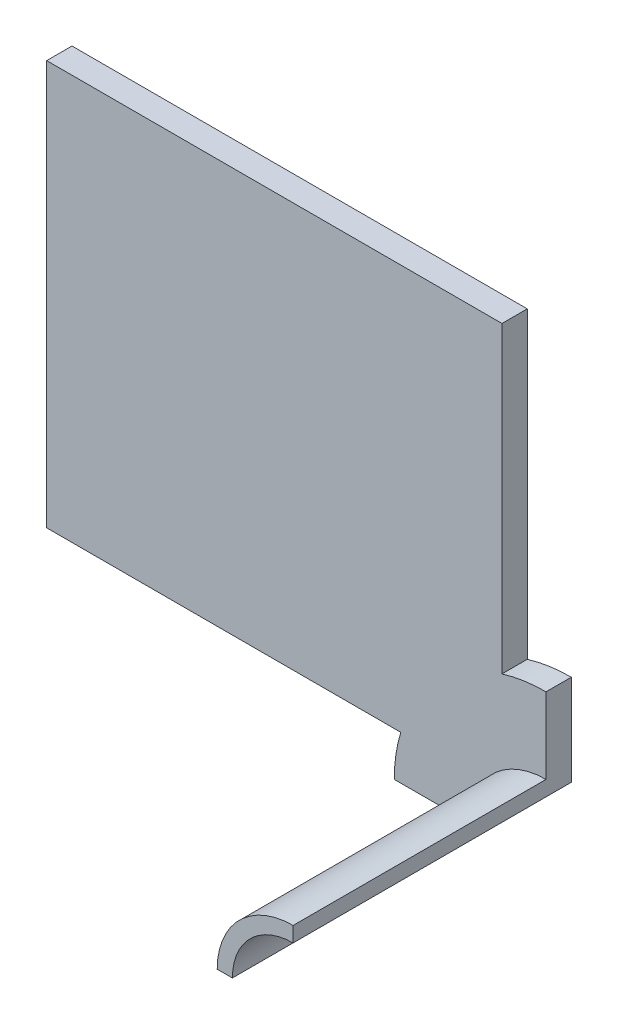
ISO-10303-21;
HEADER;
FILE_DESCRIPTION(('STEP AP214'),'2;1');
FILE_NAME('part.step','',(''),(''),'','','');
FILE_SCHEMA(('AUTOMOTIVE_DESIGN { 1 0 10303 214 1 1 1 1 }'));
ENDSEC;
DATA;
#1=APPLICATION_CONTEXT('core data for automotive mechanical design processes');
#2=APPLICATION_PROTOCOL_DEFINITION('international standard','automotive_design',2000,#1);
#3=PRODUCT_CONTEXT('',#1,'mechanical');
#4=PRODUCT('Part','Part','',(#3));
#5=PRODUCT_RELATED_PRODUCT_CATEGORY('part','',(#4));
#6=PRODUCT_DEFINITION_FORMATION('','',#4);
#7=PRODUCT_DEFINITION_CONTEXT('part definition',#1,'design');
#8=PRODUCT_DEFINITION('design','',#6,#7);
#9=PRODUCT_DEFINITION_SHAPE('','',#8);
#10=(LENGTH_UNIT() NAMED_UNIT(*) SI_UNIT(.MILLI.,.METRE.));
#11=(NAMED_UNIT(*) PLANE_ANGLE_UNIT() SI_UNIT($,.RADIAN.));
#12=(NAMED_UNIT(*) SI_UNIT($,.STERADIAN.) SOLID_ANGLE_UNIT());
#13=UNCERTAINTY_MEASURE_WITH_UNIT(LENGTH_MEASURE(1.E-05),#10,'distance_accuracy_value','');
#14=(GEOMETRIC_REPRESENTATION_CONTEXT(3) GLOBAL_UNCERTAINTY_ASSIGNED_CONTEXT((#13)) GLOBAL_UNIT_ASSIGNED_CONTEXT((#10,
#11,#12)) REPRESENTATION_CONTEXT('',''));
#15=CARTESIAN_POINT('',(0.,0.,0.));
#16=DIRECTION('',(0.,0.,1.));
#17=DIRECTION('',(1.,0.,0.));
#18=AXIS2_PLACEMENT_3D('',#15,#16,#17);
#19=CARTESIAN_POINT('',(0.489385379979,-0.435047626992,0.55));
#20=DIRECTION('',(0.,0.,1.));
#21=DIRECTION('',(1.,0.,0.));
#22=AXIS2_PLACEMENT_3D('',#19,#20,#21);
#23=PLANE('',#22);
#24=DIRECTION('',(0.,-1.,0.));
#25=VECTOR('',#24,1.);
#26=CARTESIAN_POINT('',(0.987082869339,-0.587082869339,0.55));
#27=LINE('',#26,#25);
#28=CARTESIAN_POINT('',(0.987082869339,-0.737082869339,0.55));
#29=VERTEX_POINT('',#28);
#30=CARTESIAN_POINT('',(0.987082869339,-0.767082869339,0.55));
#31=VERTEX_POINT('',#30);
#32=EDGE_CURVE('E132',#29,#31,#27,.T.);
#33=ORIENTED_EDGE('',*,*,#32,.F.);
#34=CARTESIAN_POINT('',(0.987082869339,-0.887082869339,0.55));
#35=DIRECTION('',(0.,0.,1.));
#36=DIRECTION('',(1.,0.,0.));
#37=AXIS2_PLACEMENT_3D('',#34,#35,#36);
#38=CIRCLE('',#37,0.15);
#39=CARTESIAN_POINT('',(0.837082869339,-0.887082869339,0.55));
#40=VERTEX_POINT('',#39);
#41=EDGE_CURVE('E11',#29,#40,#38,.T.);
#42=ORIENTED_EDGE('',*,*,#41,.T.);
#43=DIRECTION('',(1.,0.,0.));
#44=VECTOR('',#43,1.);
#45=CARTESIAN_POINT('',(0.687082869339,-0.887082869339,0.55));
#46=LINE('',#45,#44);
#47=CARTESIAN_POINT('',(0.867082869339,-0.887082869339,0.55));
#48=VERTEX_POINT('',#47);
#49=EDGE_CURVE('E167',#40,#48,#46,.T.);
#50=ORIENTED_EDGE('',*,*,#49,.T.);
#51=CARTESIAN_POINT('',(0.987082869339,-0.887082869339,0.55));
#52=DIRECTION('',(0.,0.,1.));
#53=DIRECTION('',(1.,0.,0.));
#54=AXIS2_PLACEMENT_3D('',#51,#52,#53);
#55=CIRCLE('',#54,0.12);
#56=EDGE_CURVE('E26',#31,#48,#55,.T.);
#57=ORIENTED_EDGE('',*,*,#56,.F.);
#58=EDGE_LOOP('',(#33,#42,#50,#57));
#59=FACE_BOUND('',#58,.T.);
#60=ADVANCED_FACE('F17',(#59),#23,.T.);
#61=CARTESIAN_POINT('',(0.987082869339,-0.887082869339,0.55));
#62=DIRECTION('',(0.,0.,1.));
#63=DIRECTION('',(1.,0.,0.));
#64=AXIS2_PLACEMENT_3D('',#61,#62,#63);
#65=CYLINDRICAL_SURFACE('',#64,0.15);
#66=DIRECTION('',(0.,0.,-1.));
#67=VECTOR('',#66,1.);
#68=CARTESIAN_POINT('',(0.987082869339,-0.737082869339,0.55));
#69=LINE('',#68,#67);
#70=CARTESIAN_POINT('',(0.987082869339,-0.737082869339,0.05));
#71=VERTEX_POINT('',#70);
#72=EDGE_CURVE('E127',#29,#71,#69,.T.);
#73=ORIENTED_EDGE('',*,*,#72,.T.);
#74=CARTESIAN_POINT('',(0.987082869339,-0.887082869339,0.05));
#75=DIRECTION('',(0.,0.,1.));
#76=DIRECTION('',(1.,0.,0.));
#77=AXIS2_PLACEMENT_3D('',#74,#75,#76);
#78=CIRCLE('',#77,0.15);
#79=CARTESIAN_POINT('',(0.837082869339,-0.887082869339,0.05));
#80=VERTEX_POINT('',#79);
#81=EDGE_CURVE('E145',#71,#80,#78,.T.);
#82=ORIENTED_EDGE('',*,*,#81,.T.);
#83=DIRECTION('',(0.,0.,-1.));
#84=VECTOR('',#83,1.);
#85=CARTESIAN_POINT('',(0.837082869339,-0.887082869339,0.55));
#86=LINE('',#85,#84);
#87=EDGE_CURVE('E129',#40,#80,#86,.T.);
#88=ORIENTED_EDGE('',*,*,#87,.F.);
#89=ORIENTED_EDGE('',*,*,#41,.F.);
#90=EDGE_LOOP('',(#73,#82,#88,#89));
#91=FACE_BOUND('',#90,.T.);
#92=ADVANCED_FACE('F124',(#91),#65,.T.);
#93=CARTESIAN_POINT('',(0.987082869339,-0.887082869339,0.));
#94=DIRECTION('',(0.,0.,-1.));
#95=DIRECTION('',(1.,0.,0.));
#96=AXIS2_PLACEMENT_3D('',#93,#94,#95);
#97=CYLINDRICAL_SURFACE('',#96,0.12);
#98=DIRECTION('',(0.,0.,1.));
#99=VECTOR('',#98,1.);
#100=CARTESIAN_POINT('',(0.987082869339,-0.767082869339,0.));
#101=LINE('',#100,#99);
#102=CARTESIAN_POINT('',(0.987082869339,-0.767082869339,0.));
#103=VERTEX_POINT('',#102);
#104=EDGE_CURVE('E135',#103,#31,#101,.T.);
#105=ORIENTED_EDGE('',*,*,#104,.T.);
#106=ORIENTED_EDGE('',*,*,#56,.T.);
#107=DIRECTION('',(0.,0.,1.));
#108=VECTOR('',#107,1.);
#109=CARTESIAN_POINT('',(0.867082869339,-0.887082869339,0.));
#110=LINE('',#109,#108);
#111=CARTESIAN_POINT('',(0.867082869339,-0.887082869339,0.));
#112=VERTEX_POINT('',#111);
#113=EDGE_CURVE('E163',#112,#48,#110,.T.);
#114=ORIENTED_EDGE('',*,*,#113,.F.);
#115=CARTESIAN_POINT('',(0.987082869339,-0.887082869339,0.));
#116=DIRECTION('',(0.,0.,1.));
#117=DIRECTION('',(1.,0.,0.));
#118=AXIS2_PLACEMENT_3D('',#115,#116,#117);
#119=CIRCLE('',#118,0.12);
#120=EDGE_CURVE('E304',#103,#112,#119,.T.);
#121=ORIENTED_EDGE('',*,*,#120,.F.);
#122=EDGE_LOOP('',(#105,#106,#114,#121));
#123=FACE_BOUND('',#122,.T.);
#124=ADVANCED_FACE('F19',(#123),#97,.F.);
#125=CARTESIAN_POINT('',(0.687082869339,-0.887082869339,0.));
#126=DIRECTION('',(0.,1.,0.));
#127=DIRECTION('',(1.,0.,0.));
#128=AXIS2_PLACEMENT_3D('',#125,#126,#127);
#129=PLANE('',#128);
#130=DIRECTION('',(1.,0.,0.));
#131=VECTOR('',#130,1.);
#132=CARTESIAN_POINT('',(0.687082869339,-0.887082869339,0.));
#133=LINE('',#132,#131);
#134=CARTESIAN_POINT('',(0.687082869339,-0.887082869339,0.));
#135=VERTEX_POINT('',#134);
#136=EDGE_CURVE('E340',#135,#112,#133,.T.);
#137=ORIENTED_EDGE('',*,*,#136,.T.);
#138=ORIENTED_EDGE('',*,*,#113,.T.);
#139=ORIENTED_EDGE('',*,*,#49,.F.);
#140=ORIENTED_EDGE('',*,*,#87,.T.);
#141=DIRECTION('',(-1.,0.,0.));
#142=VECTOR('',#141,1.);
#143=CARTESIAN_POINT('',(0.837082869339,-0.887082869339,0.05));
#144=LINE('',#143,#142);
#145=CARTESIAN_POINT('',(0.687082869339,-0.887082869339,0.05));
#146=VERTEX_POINT('',#145);
#147=EDGE_CURVE('E379',#80,#146,#144,.T.);
#148=ORIENTED_EDGE('',*,*,#147,.T.);
#149=DIRECTION('',(0.,0.,1.));
#150=VECTOR('',#149,1.);
#151=CARTESIAN_POINT('',(0.687082869339,-0.887082869339,0.));
#152=LINE('',#151,#150);
#153=EDGE_CURVE('E160',#135,#146,#152,.T.);
#154=ORIENTED_EDGE('',*,*,#153,.F.);
#155=EDGE_LOOP('',(#137,#138,#139,#140,#148,#154));
#156=FACE_BOUND('',#155,.T.);
#157=ADVANCED_FACE('F262',(#156),#129,.F.);
#158=CARTESIAN_POINT('',(0.987082869339,-0.887082869339,0.));
#159=DIRECTION('',(0.,0.,-1.));
#160=DIRECTION('',(1.,0.,0.));
#161=AXIS2_PLACEMENT_3D('',#158,#159,#160);
#162=CYLINDRICAL_SURFACE('',#161,0.3);
#163=CARTESIAN_POINT('',(0.987082869339,-0.887082869339,0.));
#164=DIRECTION('',(0.,0.,1.));
#165=DIRECTION('',(1.,0.,0.));
#166=AXIS2_PLACEMENT_3D('',#163,#164,#165);
#167=CIRCLE('',#166,0.3);
#168=CARTESIAN_POINT('',(0.7,-0.8,0.));
#169=VERTEX_POINT('',#168);
#170=EDGE_CURVE('E335',#169,#135,#167,.T.);
#171=ORIENTED_EDGE('',*,*,#170,.T.);
#172=ORIENTED_EDGE('',*,*,#153,.T.);
#173=CARTESIAN_POINT('',(0.987082869339,-0.887082869339,0.05));
#174=DIRECTION('',(0.,0.,1.));
#175=DIRECTION('',(1.,0.,0.));
#176=AXIS2_PLACEMENT_3D('',#173,#174,#175);
#177=CIRCLE('',#176,0.3);
#178=CARTESIAN_POINT('',(0.7,-0.8,0.05));
#179=VERTEX_POINT('',#178);
#180=EDGE_CURVE('E375',#179,#146,#177,.T.);
#181=ORIENTED_EDGE('',*,*,#180,.F.);
#182=DIRECTION('',(0.,0.,1.));
#183=VECTOR('',#182,1.);
#184=CARTESIAN_POINT('',(0.7,-0.8,0.));
#185=LINE('',#184,#183);
#186=EDGE_CURVE('E157',#169,#179,#185,.T.);
#187=ORIENTED_EDGE('',*,*,#186,.F.);
#188=EDGE_LOOP('',(#171,#172,#181,#187));
#189=FACE_BOUND('',#188,.T.);
#190=ADVANCED_FACE('F257',(#189),#162,.T.);
#191=CARTESIAN_POINT('',(0.,-0.8,0.));
#192=DIRECTION('',(0.,1.,0.));
#193=DIRECTION('',(1.,0.,0.));
#194=AXIS2_PLACEMENT_3D('',#191,#192,#193);
#195=PLANE('',#194);
#196=DIRECTION('',(1.,0.,0.));
#197=VECTOR('',#196,1.);
#198=CARTESIAN_POINT('',(0.,-0.8,0.));
#199=LINE('',#198,#197);
#200=CARTESIAN_POINT('',(0.,-0.8,0.));
#201=VERTEX_POINT('',#200);
#202=EDGE_CURVE('E339',#201,#169,#199,.T.);
#203=ORIENTED_EDGE('',*,*,#202,.T.);
#204=ORIENTED_EDGE('',*,*,#186,.T.);
#205=DIRECTION('',(1.,0.,0.));
#206=VECTOR('',#205,1.);
#207=CARTESIAN_POINT('',(0.,-0.8,0.05));
#208=LINE('',#207,#206);
#209=CARTESIAN_POINT('',(0.,-0.8,0.05));
#210=VERTEX_POINT('',#209);
#211=EDGE_CURVE('E371',#210,#179,#208,.T.);
#212=ORIENTED_EDGE('',*,*,#211,.F.);
#213=DIRECTION('',(0.,0.,1.));
#214=VECTOR('',#213,1.);
#215=CARTESIAN_POINT('',(0.,-0.8,0.));
#216=LINE('',#215,#214);
#217=EDGE_CURVE('E154',#201,#210,#216,.T.);
#218=ORIENTED_EDGE('',*,*,#217,.F.);
#219=EDGE_LOOP('',(#203,#204,#212,#218));
#220=FACE_BOUND('',#219,.T.);
#221=ADVANCED_FACE('F244',(#220),#195,.F.);
#222=CARTESIAN_POINT('',(0.,0.,0.));
#223=DIRECTION('',(1.,0.,0.));
#224=DIRECTION('',(0.,1.,0.));
#225=AXIS2_PLACEMENT_3D('',#222,#223,#224);
#226=PLANE('',#225);
#227=DIRECTION('',(0.,-1.,0.));
#228=VECTOR('',#227,1.);
#229=CARTESIAN_POINT('',(0.,0.,0.));
#230=LINE('',#229,#228);
#231=CARTESIAN_POINT('',(0.,0.,0.));
#232=VERTEX_POINT('',#231);
#233=EDGE_CURVE('E350',#232,#201,#230,.T.);
#234=ORIENTED_EDGE('',*,*,#233,.T.);
#235=ORIENTED_EDGE('',*,*,#217,.T.);
#236=DIRECTION('',(0.,-1.,0.));
#237=VECTOR('',#236,1.);
#238=CARTESIAN_POINT('',(0.,0.,0.05));
#239=LINE('',#238,#237);
#240=CARTESIAN_POINT('',(0.,0.,0.05));
#241=VERTEX_POINT('',#240);
#242=EDGE_CURVE('E367',#241,#210,#239,.T.);
#243=ORIENTED_EDGE('',*,*,#242,.F.);
#244=DIRECTION('',(0.,0.,1.));
#245=VECTOR('',#244,1.);
#246=CARTESIAN_POINT('',(0.,0.,0.));
#247=LINE('',#246,#245);
#248=EDGE_CURVE('E151',#232,#241,#247,.T.);
#249=ORIENTED_EDGE('',*,*,#248,.F.);
#250=EDGE_LOOP('',(#234,#235,#243,#249));
#251=FACE_BOUND('',#250,.T.);
#252=ADVANCED_FACE('F235',(#251),#226,.F.);
#253=CARTESIAN_POINT('',(0.9,0.,0.));
#254=DIRECTION('',(0.,-1.,0.));
#255=DIRECTION('',(0.,0.,-1.));
#256=AXIS2_PLACEMENT_3D('',#253,#254,#255);
#257=PLANE('',#256);
#258=DIRECTION('',(-1.,0.,0.));
#259=VECTOR('',#258,1.);
#260=CARTESIAN_POINT('',(0.9,0.,0.));
#261=LINE('',#260,#259);
#262=CARTESIAN_POINT('',(0.9,0.,0.));
#263=VERTEX_POINT('',#262);
#264=EDGE_CURVE('E333',#263,#232,#261,.T.);
#265=ORIENTED_EDGE('',*,*,#264,.T.);
#266=ORIENTED_EDGE('',*,*,#248,.T.);
#267=DIRECTION('',(1.,0.,0.));
#268=VECTOR('',#267,1.);
#269=CARTESIAN_POINT('',(0.,0.,0.05));
#270=LINE('',#269,#268);
#271=CARTESIAN_POINT('',(0.9,0.,0.05));
#272=VERTEX_POINT('',#271);
#273=EDGE_CURVE('E345',#241,#272,#270,.T.);
#274=ORIENTED_EDGE('',*,*,#273,.T.);
#275=DIRECTION('',(0.,0.,1.));
#276=VECTOR('',#275,1.);
#277=CARTESIAN_POINT('',(0.9,0.,0.));
#278=LINE('',#277,#276);
#279=EDGE_CURVE('E332',#263,#272,#278,.T.);
#280=ORIENTED_EDGE('',*,*,#279,.F.);
#281=EDGE_LOOP('',(#265,#266,#274,#280));
#282=FACE_BOUND('',#281,.T.);
#283=ADVANCED_FACE('F227',(#282),#257,.F.);
#284=CARTESIAN_POINT('',(0.987082869339,-0.587082869339,0.));
#285=DIRECTION('',(1.,0.,0.));
#286=DIRECTION('',(0.,1.,0.));
#287=AXIS2_PLACEMENT_3D('',#284,#285,#286);
#288=PLANE('',#287);
#289=DIRECTION('',(0.,-1.,0.));
#290=VECTOR('',#289,1.);
#291=CARTESIAN_POINT('',(0.987082869339,-0.587082869339,0.));
#292=LINE('',#291,#290);
#293=CARTESIAN_POINT('',(0.987082869339,-0.587082869339,0.));
#294=VERTEX_POINT('',#293);
#295=EDGE_CURVE('E306',#294,#103,#292,.T.);
#296=ORIENTED_EDGE('',*,*,#295,.F.);
#297=DIRECTION('',(0.,0.,1.));
#298=VECTOR('',#297,1.);
#299=CARTESIAN_POINT('',(0.987082869339,-0.587082869339,0.));
#300=LINE('',#299,#298);
#301=CARTESIAN_POINT('',(0.987082869339,-0.587082869339,0.05));
#302=VERTEX_POINT('',#301);
#303=EDGE_CURVE('E308',#294,#302,#300,.T.);
#304=ORIENTED_EDGE('',*,*,#303,.T.);
#305=DIRECTION('',(0.,1.,0.));
#306=VECTOR('',#305,1.);
#307=CARTESIAN_POINT('',(0.987082869339,-0.737082869339,0.05));
#308=LINE('',#307,#306);
#309=EDGE_CURVE('E139',#71,#302,#308,.T.);
#310=ORIENTED_EDGE('',*,*,#309,.F.);
#311=ORIENTED_EDGE('',*,*,#72,.F.);
#312=ORIENTED_EDGE('',*,*,#32,.T.);
#313=ORIENTED_EDGE('',*,*,#104,.F.);
#314=EDGE_LOOP('',(#296,#304,#310,#311,#312,#313));
#315=FACE_BOUND('',#314,.T.);
#316=ADVANCED_FACE('F137',(#315),#288,.T.);
#317=CARTESIAN_POINT('',(0.486568507104,-0.432395853378,0.05));
#318=DIRECTION('',(0.,0.,1.));
#319=DIRECTION('',(1.,0.,0.));
#320=AXIS2_PLACEMENT_3D('',#317,#318,#319);
#321=PLANE('',#320);
#322=ORIENTED_EDGE('',*,*,#273,.F.);
#323=ORIENTED_EDGE('',*,*,#242,.T.);
#324=ORIENTED_EDGE('',*,*,#211,.T.);
#325=ORIENTED_EDGE('',*,*,#180,.T.);
#326=ORIENTED_EDGE('',*,*,#147,.F.);
#327=ORIENTED_EDGE('',*,*,#81,.F.);
#328=ORIENTED_EDGE('',*,*,#309,.T.);
#329=CARTESIAN_POINT('',(0.987082869339,-0.887082869339,0.05));
#330=DIRECTION('',(0.,0.,1.));
#331=DIRECTION('',(1.,0.,0.));
#332=AXIS2_PLACEMENT_3D('',#329,#330,#331);
#333=CIRCLE('',#332,0.3);
#334=CARTESIAN_POINT('',(0.9,-0.6,0.05));
#335=VERTEX_POINT('',#334);
#336=EDGE_CURVE('E317',#302,#335,#333,.T.);
#337=ORIENTED_EDGE('',*,*,#336,.T.);
#338=DIRECTION('',(0.,-1.,0.));
#339=VECTOR('',#338,1.);
#340=CARTESIAN_POINT('',(0.9,0.,0.05));
#341=LINE('',#340,#339);
#342=EDGE_CURVE('E343',#272,#335,#341,.T.);
#343=ORIENTED_EDGE('',*,*,#342,.F.);
#344=EDGE_LOOP('',(#322,#323,#324,#325,#326,#327,#328,#337,#343));
#345=FACE_BOUND('',#344,.T.);
#346=ADVANCED_FACE('F210',(#345),#321,.T.);
#347=CARTESIAN_POINT('',(0.9,-0.6,0.));
#348=DIRECTION('',(-1.,0.,0.));
#349=DIRECTION('',(0.,0.,1.));
#350=AXIS2_PLACEMENT_3D('',#347,#348,#349);
#351=PLANE('',#350);
#352=DIRECTION('',(0.,1.,0.));
#353=VECTOR('',#352,1.);
#354=CARTESIAN_POINT('',(0.9,-0.6,0.));
#355=LINE('',#354,#353);
#356=CARTESIAN_POINT('',(0.9,-0.6,0.));
#357=VERTEX_POINT('',#356);
#358=EDGE_CURVE('E322',#357,#263,#355,.T.);
#359=ORIENTED_EDGE('',*,*,#358,.T.);
#360=ORIENTED_EDGE('',*,*,#279,.T.);
#361=ORIENTED_EDGE('',*,*,#342,.T.);
#362=DIRECTION('',(0.,0.,1.));
#363=VECTOR('',#362,1.);
#364=CARTESIAN_POINT('',(0.9,-0.6,0.));
#365=LINE('',#364,#363);
#366=EDGE_CURVE('E325',#357,#335,#365,.T.);
#367=ORIENTED_EDGE('',*,*,#366,.F.);
#368=EDGE_LOOP('',(#359,#360,#361,#367));
#369=FACE_BOUND('',#368,.T.);
#370=ADVANCED_FACE('F201',(#369),#351,.F.);
#371=CARTESIAN_POINT('',(0.489385379979,-0.435047626992,0.));
#372=DIRECTION('',(0.,0.,1.));
#373=DIRECTION('',(1.,0.,0.));
#374=AXIS2_PLACEMENT_3D('',#371,#372,#373);
#375=PLANE('',#374);
#376=CARTESIAN_POINT('',(0.987082869339,-0.887082869339,0.));
#377=DIRECTION('',(0.,0.,1.));
#378=DIRECTION('',(1.,0.,0.));
#379=AXIS2_PLACEMENT_3D('',#376,#377,#378);
#380=CIRCLE('',#379,0.3);
#381=EDGE_CURVE('E315',#294,#357,#380,.T.);
#382=ORIENTED_EDGE('',*,*,#381,.F.);
#383=ORIENTED_EDGE('',*,*,#295,.T.);
#384=ORIENTED_EDGE('',*,*,#120,.T.);
#385=ORIENTED_EDGE('',*,*,#136,.F.);
#386=ORIENTED_EDGE('',*,*,#170,.F.);
#387=ORIENTED_EDGE('',*,*,#202,.F.);
#388=ORIENTED_EDGE('',*,*,#233,.F.);
#389=ORIENTED_EDGE('',*,*,#264,.F.);
#390=ORIENTED_EDGE('',*,*,#358,.F.);
#391=EDGE_LOOP('',(#382,#383,#384,#385,#386,#387,#388,#389,#390));
#392=FACE_BOUND('',#391,.T.);
#393=ADVANCED_FACE('F183',(#392),#375,.F.);
#394=CARTESIAN_POINT('',(0.987082869339,-0.887082869339,0.));
#395=DIRECTION('',(0.,0.,-1.));
#396=DIRECTION('',(1.,0.,0.));
#397=AXIS2_PLACEMENT_3D('',#394,#395,#396);
#398=CYLINDRICAL_SURFACE('',#397,0.3);
#399=ORIENTED_EDGE('',*,*,#381,.T.);
#400=ORIENTED_EDGE('',*,*,#366,.T.);
#401=ORIENTED_EDGE('',*,*,#336,.F.);
#402=ORIENTED_EDGE('',*,*,#303,.F.);
#403=EDGE_LOOP('',(#399,#400,#401,#402));
#404=FACE_BOUND('',#403,.T.);
#405=ADVANCED_FACE('F178',(#404),#398,.T.);
#406=CLOSED_SHELL('',(#60,#92,#124,#157,#190,#221,#252,#283,#316,#346,#370,#393,#405));
#407=MANIFOLD_SOLID_BREP('B1',#406);
#408=ADVANCED_BREP_SHAPE_REPRESENTATION('',(#18,#407),#14);
#409=SHAPE_DEFINITION_REPRESENTATION(#9,#408);
ENDSEC;
END-ISO-10303-21;
